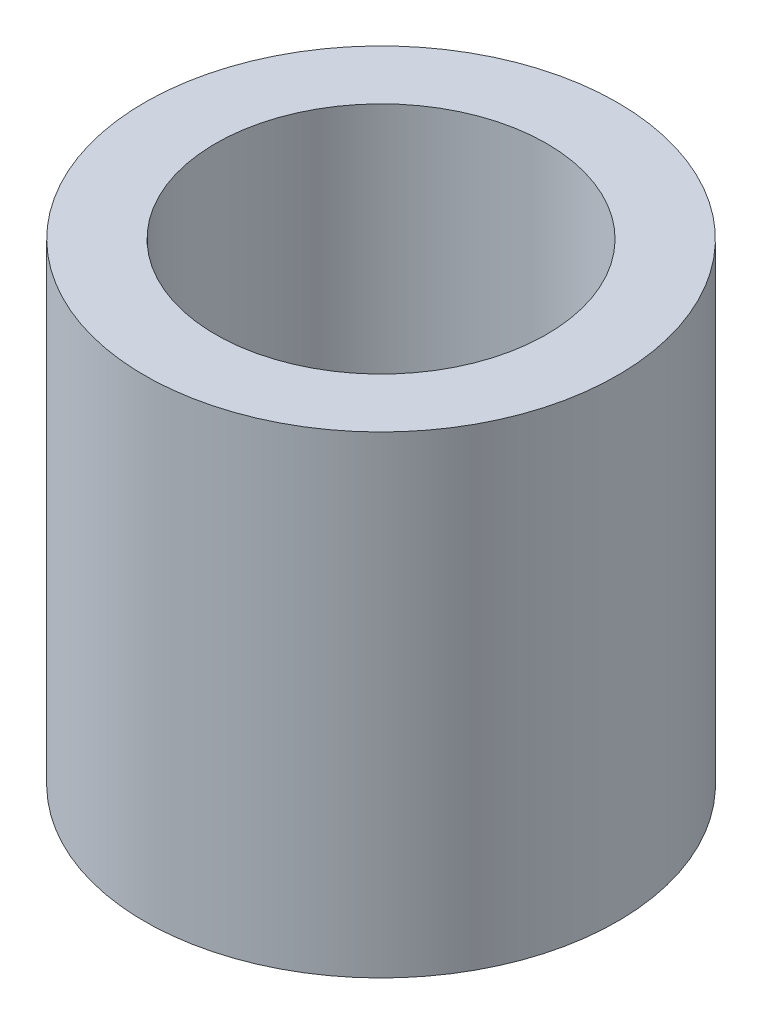
ISO-10303-21;
HEADER;
FILE_DESCRIPTION(('STEP AP214'),'2;1');
FILE_NAME('part.step','',(''),(''),'','','');
FILE_SCHEMA(('AUTOMOTIVE_DESIGN { 1 0 10303 214 1 1 1 1 }'));
ENDSEC;
DATA;
#1=APPLICATION_CONTEXT('core data for automotive mechanical design processes');
#2=APPLICATION_PROTOCOL_DEFINITION('international standard','automotive_design',2000,#1);
#3=PRODUCT_CONTEXT('',#1,'mechanical');
#4=PRODUCT('Part','Part','',(#3));
#5=PRODUCT_RELATED_PRODUCT_CATEGORY('part','',(#4));
#6=PRODUCT_DEFINITION_FORMATION('','',#4);
#7=PRODUCT_DEFINITION_CONTEXT('part definition',#1,'design');
#8=PRODUCT_DEFINITION('design','',#6,#7);
#9=PRODUCT_DEFINITION_SHAPE('','',#8);
#10=(LENGTH_UNIT() NAMED_UNIT(*) SI_UNIT(.MILLI.,.METRE.));
#11=(NAMED_UNIT(*) PLANE_ANGLE_UNIT() SI_UNIT($,.RADIAN.));
#12=(NAMED_UNIT(*) SI_UNIT($,.STERADIAN.) SOLID_ANGLE_UNIT());
#13=UNCERTAINTY_MEASURE_WITH_UNIT(LENGTH_MEASURE(1.E-05),#10,'distance_accuracy_value','');
#14=(GEOMETRIC_REPRESENTATION_CONTEXT(3) GLOBAL_UNCERTAINTY_ASSIGNED_CONTEXT((#13)) GLOBAL_UNIT_ASSIGNED_CONTEXT((#10,
#11,#12)) REPRESENTATION_CONTEXT('',''));
#15=CARTESIAN_POINT('',(0.,0.,0.));
#16=DIRECTION('',(0.,0.,1.));
#17=DIRECTION('',(1.,0.,0.));
#18=AXIS2_PLACEMENT_3D('',#15,#16,#17);
#19=CARTESIAN_POINT('',(0.,0.,0.));
#20=DIRECTION('',(0.,-1.,0.));
#21=DIRECTION('',(0.,0.,-1.));
#22=AXIS2_PLACEMENT_3D('',#19,#20,#21);
#23=CYLINDRICAL_SURFACE('',#22,1.75);
#24=CARTESIAN_POINT('',(0.,5.,0.));
#25=DIRECTION('',(0.,-1.,0.));
#26=DIRECTION('',(0.,0.,-1.));
#27=AXIS2_PLACEMENT_3D('',#24,#25,#26);
#28=CIRCLE('',#27,1.75);
#29=CARTESIAN_POINT('',(0.,5.,-1.75));
#30=VERTEX_POINT('',#29);
#31=EDGE_CURVE('E10',#30,#30,#28,.T.);
#32=ORIENTED_EDGE('',*,*,#31,.F.);
#33=EDGE_LOOP('',(#32));
#34=FACE_BOUND('',#33,.T.);
#35=CARTESIAN_POINT('',(0.,0.,0.));
#36=DIRECTION('',(0.,-1.,0.));
#37=DIRECTION('',(0.,0.,-1.));
#38=AXIS2_PLACEMENT_3D('',#35,#36,#37);
#39=CIRCLE('',#38,1.75);
#40=CARTESIAN_POINT('',(0.,0.,-1.75));
#41=VERTEX_POINT('',#40);
#42=EDGE_CURVE('E51',#41,#41,#39,.T.);
#43=ORIENTED_EDGE('',*,*,#42,.T.);
#44=EDGE_LOOP('',(#43));
#45=FACE_BOUND('',#44,.T.);
#46=ADVANCED_FACE('F37',(#34,#45),#23,.F.);
#47=CARTESIAN_POINT('',(-1.75,5.,0.));
#48=DIRECTION('',(0.,-1.,0.));
#49=DIRECTION('',(0.,0.,-1.));
#50=AXIS2_PLACEMENT_3D('',#47,#48,#49);
#51=PLANE('',#50);
#52=CARTESIAN_POINT('',(0.,5.,0.));
#53=DIRECTION('',(0.,-1.,0.));
#54=DIRECTION('',(0.,0.,-1.));
#55=AXIS2_PLACEMENT_3D('',#52,#53,#54);
#56=CIRCLE('',#55,2.5);
#57=CARTESIAN_POINT('',(0.,5.,-2.5));
#58=VERTEX_POINT('',#57);
#59=EDGE_CURVE('E43',#58,#58,#56,.T.);
#60=ORIENTED_EDGE('',*,*,#59,.F.);
#61=EDGE_LOOP('',(#60));
#62=FACE_BOUND('',#61,.T.);
#63=ORIENTED_EDGE('',*,*,#31,.T.);
#64=EDGE_LOOP('',(#63));
#65=FACE_BOUND('',#64,.T.);
#66=ADVANCED_FACE('F66',(#62,#65),#51,.F.);
#67=CARTESIAN_POINT('',(0.,0.,0.));
#68=DIRECTION('',(0.,-1.,0.));
#69=DIRECTION('',(0.,0.,-1.));
#70=AXIS2_PLACEMENT_3D('',#67,#68,#69);
#71=CYLINDRICAL_SURFACE('',#70,2.5);
#72=CARTESIAN_POINT('',(0.,0.,0.));
#73=DIRECTION('',(0.,-1.,0.));
#74=DIRECTION('',(0.,0.,-1.));
#75=AXIS2_PLACEMENT_3D('',#72,#73,#74);
#76=CIRCLE('',#75,2.5);
#77=CARTESIAN_POINT('',(0.,0.,-2.5));
#78=VERTEX_POINT('',#77);
#79=EDGE_CURVE('E47',#78,#78,#76,.T.);
#80=ORIENTED_EDGE('',*,*,#79,.F.);
#81=EDGE_LOOP('',(#80));
#82=FACE_BOUND('',#81,.T.);
#83=ORIENTED_EDGE('',*,*,#59,.T.);
#84=EDGE_LOOP('',(#83));
#85=FACE_BOUND('',#84,.T.);
#86=ADVANCED_FACE('F61',(#82,#85),#71,.T.);
#87=CARTESIAN_POINT('',(-1.75,0.,0.));
#88=DIRECTION('',(0.,1.,0.));
#89=DIRECTION('',(0.,0.,1.));
#90=AXIS2_PLACEMENT_3D('',#87,#88,#89);
#91=PLANE('',#90);
#92=ORIENTED_EDGE('',*,*,#42,.F.);
#93=EDGE_LOOP('',(#92));
#94=FACE_BOUND('',#93,.T.);
#95=ORIENTED_EDGE('',*,*,#79,.T.);
#96=EDGE_LOOP('',(#95));
#97=FACE_BOUND('',#96,.T.);
#98=ADVANCED_FACE('F58',(#94,#97),#91,.F.);
#99=CLOSED_SHELL('',(#46,#66,#86,#98));
#100=MANIFOLD_SOLID_BREP('B2',#99);
#101=ADVANCED_BREP_SHAPE_REPRESENTATION('',(#18,#100),#14);
#102=SHAPE_DEFINITION_REPRESENTATION(#9,#101);
ENDSEC;
END-ISO-10303-21;
